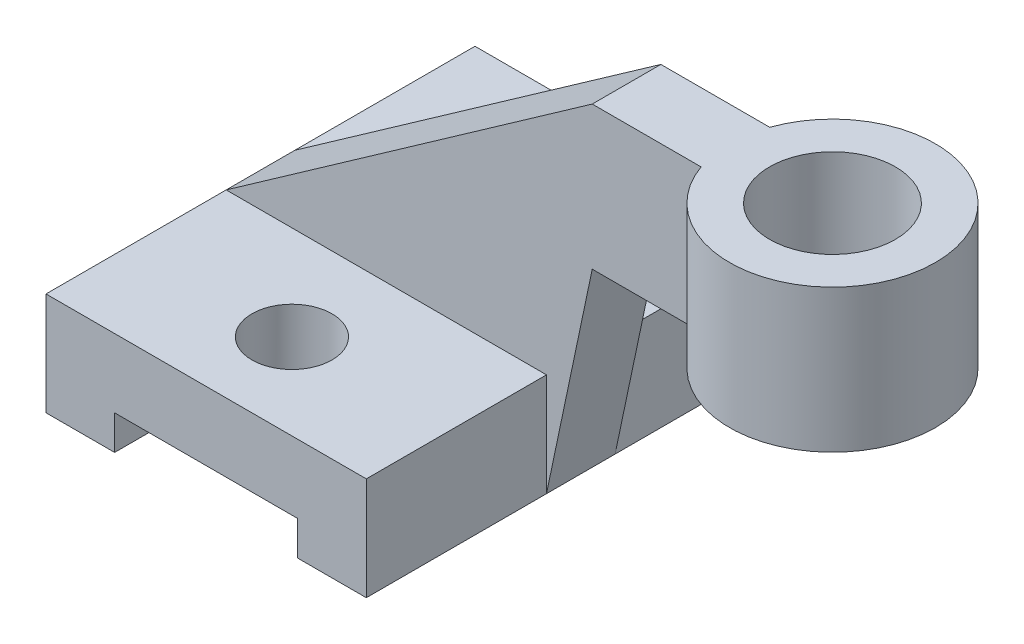
ISO-10303-21;
HEADER;
FILE_DESCRIPTION(('STEP AP214'),'2;1');
FILE_NAME('part.step','',(''),(''),'','','');
FILE_SCHEMA(('AUTOMOTIVE_DESIGN { 1 0 10303 214 1 1 1 1 }'));
ENDSEC;
DATA;
#1=APPLICATION_CONTEXT('core data for automotive mechanical design processes');
#2=APPLICATION_PROTOCOL_DEFINITION('international standard','automotive_design',2000,#1);
#3=PRODUCT_CONTEXT('',#1,'mechanical');
#4=PRODUCT('Part','Part','',(#3));
#5=PRODUCT_RELATED_PRODUCT_CATEGORY('part','',(#4));
#6=PRODUCT_DEFINITION_FORMATION('','',#4);
#7=PRODUCT_DEFINITION_CONTEXT('part definition',#1,'design');
#8=PRODUCT_DEFINITION('design','',#6,#7);
#9=PRODUCT_DEFINITION_SHAPE('','',#8);
#10=(LENGTH_UNIT() NAMED_UNIT(*) SI_UNIT(.MILLI.,.METRE.));
#11=(NAMED_UNIT(*) PLANE_ANGLE_UNIT() SI_UNIT($,.RADIAN.));
#12=(NAMED_UNIT(*) SI_UNIT($,.STERADIAN.) SOLID_ANGLE_UNIT());
#13=UNCERTAINTY_MEASURE_WITH_UNIT(LENGTH_MEASURE(1.E-05),#10,'distance_accuracy_value','');
#14=(GEOMETRIC_REPRESENTATION_CONTEXT(3) GLOBAL_UNCERTAINTY_ASSIGNED_CONTEXT((#13)) GLOBAL_UNIT_ASSIGNED_CONTEXT((#10,
#11,#12)) REPRESENTATION_CONTEXT('',''));
#15=CARTESIAN_POINT('',(0.,0.,0.));
#16=DIRECTION('',(0.,0.,1.));
#17=DIRECTION('',(1.,0.,0.));
#18=AXIS2_PLACEMENT_3D('',#15,#16,#17);
#19=CARTESIAN_POINT('',(28.,-9.,-75.));
#20=DIRECTION('',(1.,0.,0.));
#21=DIRECTION('',(0.,0.,-1.));
#22=AXIS2_PLACEMENT_3D('',#19,#20,#21);
#23=PLANE('',#22);
#24=DIRECTION('',(0.,0.,1.));
#25=VECTOR('',#24,1.);
#26=CARTESIAN_POINT('',(28.,9.,-75.));
#27=LINE('',#26,#25);
#28=CARTESIAN_POINT('',(28.,9.,-75.));
#29=VERTEX_POINT('',#28);
#30=CARTESIAN_POINT('',(28.,9.,-43.5));
#31=VERTEX_POINT('',#30);
#32=EDGE_CURVE('E47',#29,#31,#27,.T.);
#33=ORIENTED_EDGE('',*,*,#32,.T.);
#34=DIRECTION('',(0.,1.,0.));
#35=VECTOR('',#34,1.);
#36=CARTESIAN_POINT('',(28.,-9.,-43.5));
#37=LINE('',#36,#35);
#38=CARTESIAN_POINT('',(28.,-9.,-43.5));
#39=VERTEX_POINT('',#38);
#40=EDGE_CURVE('E60',#39,#31,#37,.T.);
#41=ORIENTED_EDGE('',*,*,#40,.F.);
#42=DIRECTION('',(0.,0.,1.));
#43=VECTOR('',#42,1.);
#44=CARTESIAN_POINT('',(28.,-9.,-75.));
#45=LINE('',#44,#43);
#46=CARTESIAN_POINT('',(28.,-9.,-75.));
#47=VERTEX_POINT('',#46);
#48=EDGE_CURVE('E11',#47,#39,#45,.T.);
#49=ORIENTED_EDGE('',*,*,#48,.F.);
#50=DIRECTION('',(0.,1.,0.));
#51=VECTOR('',#50,1.);
#52=CARTESIAN_POINT('',(28.,-9.,-75.));
#53=LINE('',#52,#51);
#54=EDGE_CURVE('E180',#47,#29,#53,.T.);
#55=ORIENTED_EDGE('',*,*,#54,.T.);
#56=EDGE_LOOP('',(#33,#41,#49,#55));
#57=FACE_BOUND('',#56,.T.);
#58=ADVANCED_FACE('F43',(#57),#23,.T.);
#59=CARTESIAN_POINT('',(-28.,9.,-75.));
#60=DIRECTION('',(0.,1.,0.));
#61=DIRECTION('',(0.,0.,1.));
#62=AXIS2_PLACEMENT_3D('',#59,#60,#61);
#63=PLANE('',#62);
#64=CARTESIAN_POINT('',(0.,9.,-60.));
#65=DIRECTION('',(0.,1.,0.));
#66=DIRECTION('',(0.,0.,1.));
#67=AXIS2_PLACEMENT_3D('',#64,#65,#66);
#68=CIRCLE('',#67,7.);
#69=CARTESIAN_POINT('',(0.,9.,-53.));
#70=VERTEX_POINT('',#69);
#71=EDGE_CURVE('E332',#70,#70,#68,.T.);
#72=ORIENTED_EDGE('',*,*,#71,.F.);
#73=EDGE_LOOP('',(#72));
#74=FACE_BOUND('',#73,.T.);
#75=DIRECTION('',(0.,0.,1.));
#76=VECTOR('',#75,1.);
#77=CARTESIAN_POINT('',(-28.,9.,-75.));
#78=LINE('',#77,#76);
#79=CARTESIAN_POINT('',(-28.,9.,-75.));
#80=VERTEX_POINT('',#79);
#81=CARTESIAN_POINT('',(-28.,9.,-43.5));
#82=VERTEX_POINT('',#81);
#83=EDGE_CURVE('E187',#80,#82,#78,.T.);
#84=ORIENTED_EDGE('',*,*,#83,.T.);
#85=DIRECTION('',(-1.,0.,0.));
#86=VECTOR('',#85,1.);
#87=CARTESIAN_POINT('',(28.,9.,-43.5));
#88=LINE('',#87,#86);
#89=EDGE_CURVE('E273',#31,#82,#88,.T.);
#90=ORIENTED_EDGE('',*,*,#89,.F.);
#91=ORIENTED_EDGE('',*,*,#32,.F.);
#92=DIRECTION('',(-1.,0.,0.));
#93=VECTOR('',#92,1.);
#94=CARTESIAN_POINT('',(-28.,9.,-75.));
#95=LINE('',#94,#93);
#96=EDGE_CURVE('E299',#29,#80,#95,.T.);
#97=ORIENTED_EDGE('',*,*,#96,.T.);
#98=EDGE_LOOP('',(#84,#90,#91,#97));
#99=FACE_BOUND('',#98,.T.);
#100=ADVANCED_FACE('F346',(#74,#99),#63,.T.);
#101=DIRECTION('',(0.,1.,0.));
#102=VECTOR('',#101,1.);
#103=CARTESIAN_POINT('',(28.,-9.,-31.5));
#104=LINE('',#103,#102);
#105=CARTESIAN_POINT('',(28.,-9.,-31.5));
#106=VERTEX_POINT('',#105);
#107=CARTESIAN_POINT('',(28.,9.,-31.5));
#108=VERTEX_POINT('',#107);
#109=EDGE_CURVE('E200',#106,#108,#104,.T.);
#110=ORIENTED_EDGE('',*,*,#109,.T.);
#111=CARTESIAN_POINT('',(28.,9.,0.));
#112=VERTEX_POINT('',#111);
#113=EDGE_CURVE('E158',#108,#112,#27,.T.);
#114=ORIENTED_EDGE('',*,*,#113,.T.);
#115=DIRECTION('',(0.,1.,0.));
#116=VECTOR('',#115,1.);
#117=CARTESIAN_POINT('',(28.,-9.,0.));
#118=LINE('',#117,#116);
#119=CARTESIAN_POINT('',(28.,-9.,0.));
#120=VERTEX_POINT('',#119);
#121=EDGE_CURVE('E159',#120,#112,#118,.T.);
#122=ORIENTED_EDGE('',*,*,#121,.F.);
#123=EDGE_CURVE('E52',#106,#120,#45,.T.);
#124=ORIENTED_EDGE('',*,*,#123,.F.);
#125=EDGE_LOOP('',(#110,#114,#122,#124));
#126=FACE_BOUND('',#125,.T.);
#127=ADVANCED_FACE('F45',(#126),#23,.T.);
#128=CARTESIAN_POINT('',(16.,-9.,-75.));
#129=DIRECTION('',(0.,-1.,0.));
#130=DIRECTION('',(1.,0.,0.));
#131=AXIS2_PLACEMENT_3D('',#128,#129,#130);
#132=PLANE('',#131);
#133=DIRECTION('',(1.,0.,0.));
#134=VECTOR('',#133,1.);
#135=CARTESIAN_POINT('',(16.,-9.,0.));
#136=LINE('',#135,#134);
#137=CARTESIAN_POINT('',(16.,-9.,0.));
#138=VERTEX_POINT('',#137);
#139=EDGE_CURVE('E178',#138,#120,#136,.T.);
#140=ORIENTED_EDGE('',*,*,#139,.F.);
#141=DIRECTION('',(0.,0.,1.));
#142=VECTOR('',#141,1.);
#143=CARTESIAN_POINT('',(16.,-9.,-75.));
#144=LINE('',#143,#142);
#145=CARTESIAN_POINT('',(16.,-9.,-75.));
#146=VERTEX_POINT('',#145);
#147=EDGE_CURVE('E138',#146,#138,#144,.T.);
#148=ORIENTED_EDGE('',*,*,#147,.F.);
#149=DIRECTION('',(1.,0.,0.));
#150=VECTOR('',#149,1.);
#151=CARTESIAN_POINT('',(16.,-9.,-75.));
#152=LINE('',#151,#150);
#153=EDGE_CURVE('E148',#146,#47,#152,.T.);
#154=ORIENTED_EDGE('',*,*,#153,.T.);
#155=ORIENTED_EDGE('',*,*,#48,.T.);
#156=DIRECTION('',(0.,0.,-1.));
#157=VECTOR('',#156,1.);
#158=CARTESIAN_POINT('',(28.,-9.,-31.5));
#159=LINE('',#158,#157);
#160=EDGE_CURVE('E163',#106,#39,#159,.T.);
#161=ORIENTED_EDGE('',*,*,#160,.F.);
#162=ORIENTED_EDGE('',*,*,#123,.T.);
#163=EDGE_LOOP('',(#140,#148,#154,#155,#161,#162));
#164=FACE_BOUND('',#163,.T.);
#165=ADVANCED_FACE('F204',(#164),#132,.T.);
#166=CARTESIAN_POINT('',(16.,-3.,-75.));
#167=DIRECTION('',(-1.,0.,0.));
#168=DIRECTION('',(0.,-1.,0.));
#169=AXIS2_PLACEMENT_3D('',#166,#167,#168);
#170=PLANE('',#169);
#171=DIRECTION('',(0.,-1.,0.));
#172=VECTOR('',#171,1.);
#173=CARTESIAN_POINT('',(16.,-3.,0.));
#174=LINE('',#173,#172);
#175=CARTESIAN_POINT('',(16.,-3.,0.));
#176=VERTEX_POINT('',#175);
#177=EDGE_CURVE('E133',#176,#138,#174,.T.);
#178=ORIENTED_EDGE('',*,*,#177,.F.);
#179=DIRECTION('',(0.,0.,1.));
#180=VECTOR('',#179,1.);
#181=CARTESIAN_POINT('',(16.,-3.,-75.));
#182=LINE('',#181,#180);
#183=CARTESIAN_POINT('',(16.,-3.,-75.));
#184=VERTEX_POINT('',#183);
#185=EDGE_CURVE('E127',#184,#176,#182,.T.);
#186=ORIENTED_EDGE('',*,*,#185,.F.);
#187=DIRECTION('',(0.,-1.,0.));
#188=VECTOR('',#187,1.);
#189=CARTESIAN_POINT('',(16.,-3.,-75.));
#190=LINE('',#189,#188);
#191=EDGE_CURVE('E130',#184,#146,#190,.T.);
#192=ORIENTED_EDGE('',*,*,#191,.T.);
#193=ORIENTED_EDGE('',*,*,#147,.T.);
#194=EDGE_LOOP('',(#178,#186,#192,#193));
#195=FACE_BOUND('',#194,.T.);
#196=ADVANCED_FACE('F129',(#195),#170,.T.);
#197=CARTESIAN_POINT('',(-16.,-3.,-75.));
#198=DIRECTION('',(0.,-1.,0.));
#199=DIRECTION('',(0.,0.,-1.));
#200=AXIS2_PLACEMENT_3D('',#197,#198,#199);
#201=PLANE('',#200);
#202=CARTESIAN_POINT('',(0.,-3.,-15.));
#203=DIRECTION('',(0.,-1.,0.));
#204=DIRECTION('',(0.,0.,-1.));
#205=AXIS2_PLACEMENT_3D('',#202,#203,#204);
#206=CIRCLE('',#205,7.);
#207=CARTESIAN_POINT('',(0.,-3.,-22.));
#208=VERTEX_POINT('',#207);
#209=EDGE_CURVE('E335',#208,#208,#206,.T.);
#210=ORIENTED_EDGE('',*,*,#209,.F.);
#211=EDGE_LOOP('',(#210));
#212=FACE_BOUND('',#211,.T.);
#213=CARTESIAN_POINT('',(0.,-3.,-60.));
#214=DIRECTION('',(0.,-1.,0.));
#215=DIRECTION('',(0.,0.,-1.));
#216=AXIS2_PLACEMENT_3D('',#213,#214,#215);
#217=CIRCLE('',#216,7.);
#218=CARTESIAN_POINT('',(0.,-3.,-67.));
#219=VERTEX_POINT('',#218);
#220=EDGE_CURVE('E327',#219,#219,#217,.T.);
#221=ORIENTED_EDGE('',*,*,#220,.F.);
#222=EDGE_LOOP('',(#221));
#223=FACE_BOUND('',#222,.T.);
#224=DIRECTION('',(1.,0.,0.));
#225=VECTOR('',#224,1.);
#226=CARTESIAN_POINT('',(-16.,-3.,0.));
#227=LINE('',#226,#225);
#228=CARTESIAN_POINT('',(-16.,-3.,0.));
#229=VERTEX_POINT('',#228);
#230=EDGE_CURVE('E175',#229,#176,#227,.T.);
#231=ORIENTED_EDGE('',*,*,#230,.F.);
#232=DIRECTION('',(0.,0.,1.));
#233=VECTOR('',#232,1.);
#234=CARTESIAN_POINT('',(-16.,-3.,-75.));
#235=LINE('',#234,#233);
#236=CARTESIAN_POINT('',(-16.,-3.,-75.));
#237=VERTEX_POINT('',#236);
#238=EDGE_CURVE('E139',#237,#229,#235,.T.);
#239=ORIENTED_EDGE('',*,*,#238,.F.);
#240=DIRECTION('',(1.,0.,0.));
#241=VECTOR('',#240,1.);
#242=CARTESIAN_POINT('',(-16.,-3.,-75.));
#243=LINE('',#242,#241);
#244=EDGE_CURVE('E145',#237,#184,#243,.T.);
#245=ORIENTED_EDGE('',*,*,#244,.T.);
#246=ORIENTED_EDGE('',*,*,#185,.T.);
#247=EDGE_LOOP('',(#231,#239,#245,#246));
#248=FACE_BOUND('',#247,.T.);
#249=ADVANCED_FACE('F150',(#212,#223,#248),#201,.T.);
#250=CARTESIAN_POINT('',(-16.,-9.,-75.));
#251=DIRECTION('',(1.,0.,0.));
#252=DIRECTION('',(0.,1.,0.));
#253=AXIS2_PLACEMENT_3D('',#250,#251,#252);
#254=PLANE('',#253);
#255=DIRECTION('',(0.,1.,0.));
#256=VECTOR('',#255,1.);
#257=CARTESIAN_POINT('',(-16.,-9.,0.));
#258=LINE('',#257,#256);
#259=CARTESIAN_POINT('',(-16.,-9.,0.));
#260=VERTEX_POINT('',#259);
#261=EDGE_CURVE('E172',#260,#229,#258,.T.);
#262=ORIENTED_EDGE('',*,*,#261,.F.);
#263=DIRECTION('',(0.,0.,1.));
#264=VECTOR('',#263,1.);
#265=CARTESIAN_POINT('',(-16.,-9.,-75.));
#266=LINE('',#265,#264);
#267=CARTESIAN_POINT('',(-16.,-9.,-75.));
#268=VERTEX_POINT('',#267);
#269=EDGE_CURVE('E184',#268,#260,#266,.T.);
#270=ORIENTED_EDGE('',*,*,#269,.F.);
#271=DIRECTION('',(0.,1.,0.));
#272=VECTOR('',#271,1.);
#273=CARTESIAN_POINT('',(-16.,-9.,-75.));
#274=LINE('',#273,#272);
#275=EDGE_CURVE('E151',#268,#237,#274,.T.);
#276=ORIENTED_EDGE('',*,*,#275,.T.);
#277=ORIENTED_EDGE('',*,*,#238,.T.);
#278=EDGE_LOOP('',(#262,#270,#276,#277));
#279=FACE_BOUND('',#278,.T.);
#280=ADVANCED_FACE('F373',(#279),#254,.T.);
#281=CARTESIAN_POINT('',(-28.,-9.,-75.));
#282=DIRECTION('',(0.,-1.,0.));
#283=DIRECTION('',(1.,0.,0.));
#284=AXIS2_PLACEMENT_3D('',#281,#282,#283);
#285=PLANE('',#284);
#286=DIRECTION('',(1.,0.,0.));
#287=VECTOR('',#286,1.);
#288=CARTESIAN_POINT('',(-28.,-9.,0.));
#289=LINE('',#288,#287);
#290=CARTESIAN_POINT('',(-28.,-9.,0.));
#291=VERTEX_POINT('',#290);
#292=EDGE_CURVE('E169',#291,#260,#289,.T.);
#293=ORIENTED_EDGE('',*,*,#292,.F.);
#294=DIRECTION('',(0.,0.,1.));
#295=VECTOR('',#294,1.);
#296=CARTESIAN_POINT('',(-28.,-9.,-75.));
#297=LINE('',#296,#295);
#298=CARTESIAN_POINT('',(-28.,-9.,-75.));
#299=VERTEX_POINT('',#298);
#300=EDGE_CURVE('E186',#299,#291,#297,.T.);
#301=ORIENTED_EDGE('',*,*,#300,.F.);
#302=DIRECTION('',(1.,0.,0.));
#303=VECTOR('',#302,1.);
#304=CARTESIAN_POINT('',(-28.,-9.,-75.));
#305=LINE('',#304,#303);
#306=EDGE_CURVE('E153',#299,#268,#305,.T.);
#307=ORIENTED_EDGE('',*,*,#306,.T.);
#308=ORIENTED_EDGE('',*,*,#269,.T.);
#309=EDGE_LOOP('',(#293,#301,#307,#308));
#310=FACE_BOUND('',#309,.T.);
#311=ADVANCED_FACE('F307',(#310),#285,.T.);
#312=CARTESIAN_POINT('',(-28.,-9.,-75.));
#313=DIRECTION('',(-1.,0.,0.));
#314=DIRECTION('',(0.,0.,1.));
#315=AXIS2_PLACEMENT_3D('',#312,#313,#314);
#316=PLANE('',#315);
#317=DIRECTION('',(0.,-1.,0.));
#318=VECTOR('',#317,1.);
#319=CARTESIAN_POINT('',(-28.,-9.,0.));
#320=LINE('',#319,#318);
#321=CARTESIAN_POINT('',(-28.,9.,0.));
#322=VERTEX_POINT('',#321);
#323=EDGE_CURVE('E166',#322,#291,#320,.T.);
#324=ORIENTED_EDGE('',*,*,#323,.F.);
#325=CARTESIAN_POINT('',(-28.,9.,-31.5));
#326=VERTEX_POINT('',#325);
#327=EDGE_CURVE('E189',#326,#322,#78,.T.);
#328=ORIENTED_EDGE('',*,*,#327,.F.);
#329=DIRECTION('',(0.,0.,-1.));
#330=VECTOR('',#329,1.);
#331=CARTESIAN_POINT('',(-28.,9.,-31.5));
#332=LINE('',#331,#330);
#333=EDGE_CURVE('E286',#326,#82,#332,.T.);
#334=ORIENTED_EDGE('',*,*,#333,.T.);
#335=ORIENTED_EDGE('',*,*,#83,.F.);
#336=DIRECTION('',(0.,-1.,0.));
#337=VECTOR('',#336,1.);
#338=CARTESIAN_POINT('',(-28.,-9.,-75.));
#339=LINE('',#338,#337);
#340=EDGE_CURVE('E301',#80,#299,#339,.T.);
#341=ORIENTED_EDGE('',*,*,#340,.T.);
#342=ORIENTED_EDGE('',*,*,#300,.T.);
#343=EDGE_LOOP('',(#324,#328,#334,#335,#341,#342));
#344=FACE_BOUND('',#343,.T.);
#345=ADVANCED_FACE('F311',(#344),#316,.T.);
#346=CARTESIAN_POINT('',(0.,9.,-15.));
#347=DIRECTION('',(0.,1.,0.));
#348=DIRECTION('',(0.,0.,1.));
#349=AXIS2_PLACEMENT_3D('',#346,#347,#348);
#350=CIRCLE('',#349,7.);
#351=CARTESIAN_POINT('',(0.,9.,-8.));
#352=VERTEX_POINT('',#351);
#353=EDGE_CURVE('E338',#352,#352,#350,.T.);
#354=ORIENTED_EDGE('',*,*,#353,.F.);
#355=EDGE_LOOP('',(#354));
#356=FACE_BOUND('',#355,.T.);
#357=DIRECTION('',(-1.,0.,0.));
#358=VECTOR('',#357,1.);
#359=CARTESIAN_POINT('',(28.,9.,-31.5));
#360=LINE('',#359,#358);
#361=EDGE_CURVE('E281',#108,#326,#360,.T.);
#362=ORIENTED_EDGE('',*,*,#361,.T.);
#363=ORIENTED_EDGE('',*,*,#327,.T.);
#364=DIRECTION('',(-1.,0.,0.));
#365=VECTOR('',#364,1.);
#366=CARTESIAN_POINT('',(-28.,9.,0.));
#367=LINE('',#366,#365);
#368=EDGE_CURVE('E162',#112,#322,#367,.T.);
#369=ORIENTED_EDGE('',*,*,#368,.F.);
#370=ORIENTED_EDGE('',*,*,#113,.F.);
#371=EDGE_LOOP('',(#362,#363,#369,#370));
#372=FACE_BOUND('',#371,.T.);
#373=ADVANCED_FACE('F201',(#356,#372),#63,.T.);
#374=CARTESIAN_POINT('',(0.,0.,-75.));
#375=DIRECTION('',(0.,0.,-1.));
#376=DIRECTION('',(-1.,0.,0.));
#377=AXIS2_PLACEMENT_3D('',#374,#375,#376);
#378=PLANE('',#377);
#379=ORIENTED_EDGE('',*,*,#54,.F.);
#380=ORIENTED_EDGE('',*,*,#153,.F.);
#381=ORIENTED_EDGE('',*,*,#191,.F.);
#382=ORIENTED_EDGE('',*,*,#244,.F.);
#383=ORIENTED_EDGE('',*,*,#275,.F.);
#384=ORIENTED_EDGE('',*,*,#306,.F.);
#385=ORIENTED_EDGE('',*,*,#340,.F.);
#386=ORIENTED_EDGE('',*,*,#96,.F.);
#387=EDGE_LOOP('',(#379,#380,#381,#382,#383,#384,#385,#386));
#388=FACE_BOUND('',#387,.T.);
#389=ADVANCED_FACE('F143',(#388),#378,.T.);
#390=CARTESIAN_POINT('',(0.,0.,0.));
#391=DIRECTION('',(0.,0.,-1.));
#392=DIRECTION('',(-1.,0.,0.));
#393=AXIS2_PLACEMENT_3D('',#390,#391,#392);
#394=PLANE('',#393);
#395=ORIENTED_EDGE('',*,*,#121,.T.);
#396=ORIENTED_EDGE('',*,*,#368,.T.);
#397=ORIENTED_EDGE('',*,*,#323,.T.);
#398=ORIENTED_EDGE('',*,*,#292,.T.);
#399=ORIENTED_EDGE('',*,*,#261,.T.);
#400=ORIENTED_EDGE('',*,*,#230,.T.);
#401=ORIENTED_EDGE('',*,*,#177,.T.);
#402=ORIENTED_EDGE('',*,*,#139,.T.);
#403=EDGE_LOOP('',(#395,#396,#397,#398,#399,#400,#401,#402));
#404=FACE_BOUND('',#403,.T.);
#405=ADVANCED_FACE('F203',(#404),#394,.F.);
#406=CARTESIAN_POINT('',(36.,29.,-31.5));
#407=DIRECTION('',(0.978549784986749,-0.206010481049842,0.));
#408=DIRECTION('',(0.206010481049842,0.978549784986749,0.));
#409=AXIS2_PLACEMENT_3D('',#406,#407,#408);
#410=PLANE('',#409);
#411=DIRECTION('',(-0.206010481049842,-0.978549784986749,0.));
#412=VECTOR('',#411,1.);
#413=CARTESIAN_POINT('',(36.,29.,-43.5));
#414=LINE('',#413,#412);
#415=CARTESIAN_POINT('',(36.,29.,-43.5));
#416=VERTEX_POINT('',#415);
#417=EDGE_CURVE('E289',#416,#39,#414,.T.);
#418=ORIENTED_EDGE('',*,*,#417,.F.);
#419=DIRECTION('',(0.,0.,-1.));
#420=VECTOR('',#419,1.);
#421=CARTESIAN_POINT('',(36.,29.,-31.5));
#422=LINE('',#421,#420);
#423=CARTESIAN_POINT('',(36.,29.,-31.5));
#424=VERTEX_POINT('',#423);
#425=EDGE_CURVE('E293',#424,#416,#422,.T.);
#426=ORIENTED_EDGE('',*,*,#425,.F.);
#427=DIRECTION('',(-0.206010481049842,-0.978549784986749,0.));
#428=VECTOR('',#427,1.);
#429=CARTESIAN_POINT('',(36.,29.,-31.5));
#430=LINE('',#429,#428);
#431=EDGE_CURVE('E255',#424,#106,#430,.T.);
#432=ORIENTED_EDGE('',*,*,#431,.T.);
#433=ORIENTED_EDGE('',*,*,#160,.T.);
#434=EDGE_LOOP('',(#418,#426,#432,#433));
#435=FACE_BOUND('',#434,.T.);
#436=ADVANCED_FACE('F394',(#435),#410,.T.);
#437=CARTESIAN_POINT('',(-28.,9.,-31.5));
#438=DIRECTION('',(-0.575176751990256,0.818029158386142,0.));
#439=DIRECTION('',(-0.818029158386142,-0.575176751990256,0.));
#440=AXIS2_PLACEMENT_3D('',#437,#438,#439);
#441=PLANE('',#440);
#442=DIRECTION('',(0.818029158386142,0.575176751990256,0.));
#443=VECTOR('',#442,1.);
#444=CARTESIAN_POINT('',(-28.,9.,-43.5));
#445=LINE('',#444,#443);
#446=CARTESIAN_POINT('',(36.,54.,-43.5));
#447=VERTEX_POINT('',#446);
#448=EDGE_CURVE('E276',#82,#447,#445,.T.);
#449=ORIENTED_EDGE('',*,*,#448,.F.);
#450=ORIENTED_EDGE('',*,*,#333,.F.);
#451=DIRECTION('',(0.818029158386142,0.575176751990256,0.));
#452=VECTOR('',#451,1.);
#453=CARTESIAN_POINT('',(-28.,9.,-31.5));
#454=LINE('',#453,#452);
#455=CARTESIAN_POINT('',(36.,54.,-31.5));
#456=VERTEX_POINT('',#455);
#457=EDGE_CURVE('E283',#326,#456,#454,.T.);
#458=ORIENTED_EDGE('',*,*,#457,.T.);
#459=DIRECTION('',(0.,0.,-1.));
#460=VECTOR('',#459,1.);
#461=CARTESIAN_POINT('',(36.,54.,-31.5));
#462=LINE('',#461,#460);
#463=EDGE_CURVE('E220',#456,#447,#462,.T.);
#464=ORIENTED_EDGE('',*,*,#463,.T.);
#465=EDGE_LOOP('',(#449,#450,#458,#464));
#466=FACE_BOUND('',#465,.T.);
#467=ADVANCED_FACE('F313',(#466),#441,.T.);
#468=CARTESIAN_POINT('',(0.,0.,-31.5));
#469=DIRECTION('',(0.,0.,1.));
#470=DIRECTION('',(1.,0.,0.));
#471=AXIS2_PLACEMENT_3D('',#468,#469,#470);
#472=PLANE('',#471);
#473=ORIENTED_EDGE('',*,*,#361,.F.);
#474=ORIENTED_EDGE('',*,*,#109,.F.);
#475=ORIENTED_EDGE('',*,*,#431,.F.);
#476=DIRECTION('',(-1.,0.,0.));
#477=VECTOR('',#476,1.);
#478=CARTESIAN_POINT('',(55.0294372515229,29.,-31.5));
#479=LINE('',#478,#477);
#480=CARTESIAN_POINT('',(55.0294372515229,29.,-31.5));
#481=VERTEX_POINT('',#480);
#482=EDGE_CURVE('E248',#481,#424,#479,.T.);
#483=ORIENTED_EDGE('',*,*,#482,.F.);
#484=DIRECTION('',(0.,1.,0.));
#485=VECTOR('',#484,1.);
#486=CARTESIAN_POINT('',(55.0294372515229,29.,-31.5));
#487=LINE('',#486,#485);
#488=CARTESIAN_POINT('',(55.0294372515229,54.,-31.5));
#489=VERTEX_POINT('',#488);
#490=EDGE_CURVE('E253',#481,#489,#487,.T.);
#491=ORIENTED_EDGE('',*,*,#490,.T.);
#492=DIRECTION('',(-1.,0.,0.));
#493=VECTOR('',#492,1.);
#494=CARTESIAN_POINT('',(55.0294372515229,54.,-31.5));
#495=LINE('',#494,#493);
#496=EDGE_CURVE('E314',#489,#456,#495,.T.);
#497=ORIENTED_EDGE('',*,*,#496,.T.);
#498=ORIENTED_EDGE('',*,*,#457,.F.);
#499=EDGE_LOOP('',(#473,#474,#475,#483,#491,#497,#498));
#500=FACE_BOUND('',#499,.T.);
#501=ADVANCED_FACE('F250',(#500),#472,.T.);
#502=CARTESIAN_POINT('',(0.,0.,-43.5));
#503=DIRECTION('',(0.,0.,1.));
#504=DIRECTION('',(1.,0.,0.));
#505=AXIS2_PLACEMENT_3D('',#502,#503,#504);
#506=PLANE('',#505);
#507=ORIENTED_EDGE('',*,*,#89,.T.);
#508=ORIENTED_EDGE('',*,*,#448,.T.);
#509=DIRECTION('',(1.,0.,0.));
#510=VECTOR('',#509,1.);
#511=CARTESIAN_POINT('',(55.0294372515229,54.,-43.5));
#512=LINE('',#511,#510);
#513=CARTESIAN_POINT('',(55.0294372515229,54.,-43.5));
#514=VERTEX_POINT('',#513);
#515=EDGE_CURVE('E268',#447,#514,#512,.T.);
#516=ORIENTED_EDGE('',*,*,#515,.T.);
#517=DIRECTION('',(0.,1.,0.));
#518=VECTOR('',#517,1.);
#519=CARTESIAN_POINT('',(55.0294372515229,29.,-43.5));
#520=LINE('',#519,#518);
#521=CARTESIAN_POINT('',(55.0294372515229,29.,-43.5));
#522=VERTEX_POINT('',#521);
#523=EDGE_CURVE('E274',#522,#514,#520,.T.);
#524=ORIENTED_EDGE('',*,*,#523,.F.);
#525=DIRECTION('',(1.,0.,0.));
#526=VECTOR('',#525,1.);
#527=CARTESIAN_POINT('',(55.0294372515229,29.,-43.5));
#528=LINE('',#527,#526);
#529=EDGE_CURVE('E258',#416,#522,#528,.T.);
#530=ORIENTED_EDGE('',*,*,#529,.F.);
#531=ORIENTED_EDGE('',*,*,#417,.T.);
#532=ORIENTED_EDGE('',*,*,#40,.T.);
#533=EDGE_LOOP('',(#507,#508,#516,#524,#530,#531,#532));
#534=FACE_BOUND('',#533,.T.);
#535=ADVANCED_FACE('F414',(#534),#506,.F.);
#536=CARTESIAN_POINT('',(72.,29.,-37.5));
#537=DIRECTION('',(0.,-1.,0.));
#538=DIRECTION('',(1.,0.,0.));
#539=AXIS2_PLACEMENT_3D('',#536,#537,#538);
#540=PLANE('',#539);
#541=CARTESIAN_POINT('',(72.,29.,-37.5));
#542=DIRECTION('',(0.,-1.,0.));
#543=DIRECTION('',(1.,0.,0.));
#544=AXIS2_PLACEMENT_3D('',#541,#542,#543);
#545=CIRCLE('',#544,18.);
#546=EDGE_CURVE('E259',#522,#481,#545,.T.);
#547=ORIENTED_EDGE('',*,*,#546,.T.);
#548=ORIENTED_EDGE('',*,*,#482,.T.);
#549=ORIENTED_EDGE('',*,*,#425,.T.);
#550=ORIENTED_EDGE('',*,*,#529,.T.);
#551=EDGE_LOOP('',(#547,#548,#549,#550));
#552=FACE_BOUND('',#551,.T.);
#553=CARTESIAN_POINT('',(72.,29.,-37.5));
#554=DIRECTION('',(0.,-1.,0.));
#555=DIRECTION('',(1.,0.,0.));
#556=AXIS2_PLACEMENT_3D('',#553,#554,#555);
#557=CIRCLE('',#556,11.);
#558=CARTESIAN_POINT('',(83.,29.,-37.5));
#559=VERTEX_POINT('',#558);
#560=EDGE_CURVE('E322',#559,#559,#557,.T.);
#561=ORIENTED_EDGE('',*,*,#560,.F.);
#562=EDGE_LOOP('',(#561));
#563=FACE_BOUND('',#562,.T.);
#564=ADVANCED_FACE('F262',(#552,#563),#540,.T.);
#565=CARTESIAN_POINT('',(72.,54.,-37.5));
#566=DIRECTION('',(0.,-1.,0.));
#567=DIRECTION('',(1.,0.,0.));
#568=AXIS2_PLACEMENT_3D('',#565,#566,#567);
#569=PLANE('',#568);
#570=CARTESIAN_POINT('',(72.,54.,-37.5));
#571=DIRECTION('',(0.,-1.,0.));
#572=DIRECTION('',(1.,0.,0.));
#573=AXIS2_PLACEMENT_3D('',#570,#571,#572);
#574=CIRCLE('',#573,18.);
#575=EDGE_CURVE('E272',#514,#489,#574,.T.);
#576=ORIENTED_EDGE('',*,*,#575,.F.);
#577=ORIENTED_EDGE('',*,*,#515,.F.);
#578=ORIENTED_EDGE('',*,*,#463,.F.);
#579=ORIENTED_EDGE('',*,*,#496,.F.);
#580=EDGE_LOOP('',(#576,#577,#578,#579));
#581=FACE_BOUND('',#580,.T.);
#582=CARTESIAN_POINT('',(72.,54.,-37.5));
#583=DIRECTION('',(0.,-1.,0.));
#584=DIRECTION('',(1.,0.,0.));
#585=AXIS2_PLACEMENT_3D('',#582,#583,#584);
#586=CIRCLE('',#585,11.);
#587=CARTESIAN_POINT('',(83.,54.,-37.5));
#588=VERTEX_POINT('',#587);
#589=EDGE_CURVE('E324',#588,#588,#586,.T.);
#590=ORIENTED_EDGE('',*,*,#589,.T.);
#591=EDGE_LOOP('',(#590));
#592=FACE_BOUND('',#591,.T.);
#593=ADVANCED_FACE('F318',(#581,#592),#569,.F.);
#594=CARTESIAN_POINT('',(72.,29.,-37.5));
#595=DIRECTION('',(0.,1.,0.));
#596=DIRECTION('',(-1.,0.,0.));
#597=AXIS2_PLACEMENT_3D('',#594,#595,#596);
#598=CYLINDRICAL_SURFACE('',#597,18.);
#599=ORIENTED_EDGE('',*,*,#575,.T.);
#600=ORIENTED_EDGE('',*,*,#490,.F.);
#601=ORIENTED_EDGE('',*,*,#546,.F.);
#602=ORIENTED_EDGE('',*,*,#523,.T.);
#603=EDGE_LOOP('',(#599,#600,#601,#602));
#604=FACE_BOUND('',#603,.T.);
#605=ADVANCED_FACE('F270',(#604),#598,.T.);
#606=CARTESIAN_POINT('',(72.,29.,-37.5));
#607=DIRECTION('',(0.,1.,0.));
#608=DIRECTION('',(-1.,0.,0.));
#609=AXIS2_PLACEMENT_3D('',#606,#607,#608);
#610=CYLINDRICAL_SURFACE('',#609,11.);
#611=ORIENTED_EDGE('',*,*,#560,.T.);
#612=EDGE_LOOP('',(#611));
#613=FACE_BOUND('',#612,.T.);
#614=ORIENTED_EDGE('',*,*,#589,.F.);
#615=EDGE_LOOP('',(#614));
#616=FACE_BOUND('',#615,.T.);
#617=ADVANCED_FACE('F429',(#613,#616),#610,.F.);
#618=CARTESIAN_POINT('',(0.,9.,-60.));
#619=DIRECTION('',(0.,1.,0.));
#620=DIRECTION('',(0.,0.,1.));
#621=AXIS2_PLACEMENT_3D('',#618,#619,#620);
#622=CYLINDRICAL_SURFACE('',#621,7.);
#623=ORIENTED_EDGE('',*,*,#71,.T.);
#624=EDGE_LOOP('',(#623));
#625=FACE_BOUND('',#624,.T.);
#626=ORIENTED_EDGE('',*,*,#220,.T.);
#627=EDGE_LOOP('',(#626));
#628=FACE_BOUND('',#627,.T.);
#629=ADVANCED_FACE('F437',(#625,#628),#622,.F.);
#630=CARTESIAN_POINT('',(0.,9.,-15.));
#631=DIRECTION('',(0.,1.,0.));
#632=DIRECTION('',(0.,0.,1.));
#633=AXIS2_PLACEMENT_3D('',#630,#631,#632);
#634=CYLINDRICAL_SURFACE('',#633,7.);
#635=ORIENTED_EDGE('',*,*,#353,.T.);
#636=EDGE_LOOP('',(#635));
#637=FACE_BOUND('',#636,.T.);
#638=ORIENTED_EDGE('',*,*,#209,.T.);
#639=EDGE_LOOP('',(#638));
#640=FACE_BOUND('',#639,.T.);
#641=ADVANCED_FACE('F342',(#637,#640),#634,.F.);
#642=CLOSED_SHELL('',(#58,#100,#127,#165,#196,#249,#280,#311,#345,#373,#389,#405,#436,#467,#501,
#535,#564,#593,#605,#617,#629,#641));
#643=MANIFOLD_SOLID_BREP('B2',#642);
#644=ADVANCED_BREP_SHAPE_REPRESENTATION('',(#18,#643),#14);
#645=SHAPE_DEFINITION_REPRESENTATION(#9,#644);
ENDSEC;
END-ISO-10303-21;
